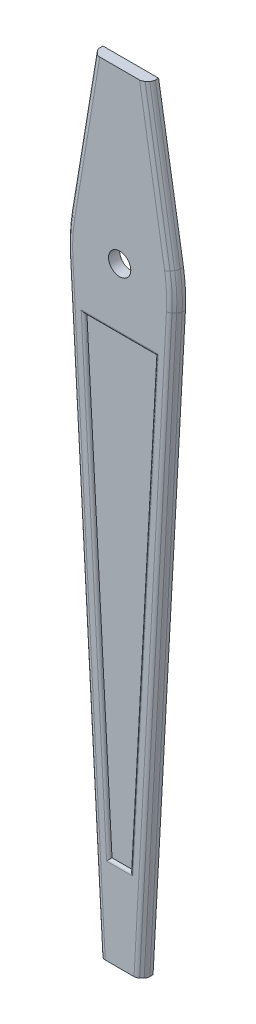
ISO-10303-21;
HEADER;
FILE_DESCRIPTION(('STEP AP214'),'2;1');
FILE_NAME('part.step','',(''),(''),'','','');
FILE_SCHEMA(('AUTOMOTIVE_DESIGN { 1 0 10303 214 1 1 1 1 }'));
ENDSEC;
DATA;
#1=APPLICATION_CONTEXT('core data for automotive mechanical design processes');
#2=APPLICATION_PROTOCOL_DEFINITION('international standard','automotive_design',2000,#1);
#3=PRODUCT_CONTEXT('',#1,'mechanical');
#4=PRODUCT('Part','Part','',(#3));
#5=PRODUCT_RELATED_PRODUCT_CATEGORY('part','',(#4));
#6=PRODUCT_DEFINITION_FORMATION('','',#4);
#7=PRODUCT_DEFINITION_CONTEXT('part definition',#1,'design');
#8=PRODUCT_DEFINITION('design','',#6,#7);
#9=PRODUCT_DEFINITION_SHAPE('','',#8);
#10=(LENGTH_UNIT() NAMED_UNIT(*) SI_UNIT(.MILLI.,.METRE.));
#11=(NAMED_UNIT(*) PLANE_ANGLE_UNIT() SI_UNIT($,.RADIAN.));
#12=(NAMED_UNIT(*) SI_UNIT($,.STERADIAN.) SOLID_ANGLE_UNIT());
#13=UNCERTAINTY_MEASURE_WITH_UNIT(LENGTH_MEASURE(1.E-05),#10,'distance_accuracy_value','');
#14=(GEOMETRIC_REPRESENTATION_CONTEXT(3) GLOBAL_UNCERTAINTY_ASSIGNED_CONTEXT((#13)) GLOBAL_UNIT_ASSIGNED_CONTEXT((#10,
#11,#12)) REPRESENTATION_CONTEXT('',''));
#15=CARTESIAN_POINT('',(0.,0.,0.));
#16=DIRECTION('',(0.,0.,1.));
#17=DIRECTION('',(1.,0.,0.));
#18=AXIS2_PLACEMENT_3D('',#15,#16,#17);
#19=CARTESIAN_POINT('',(2.01343590893741,-0.163373914825652,0.2));
#20=DIRECTION('',(0.,0.,1.));
#21=DIRECTION('',(1.,0.,0.));
#22=AXIS2_PLACEMENT_3D('',#19,#20,#21);
#23=PLANE('',#22);
#24=DIRECTION('',(0.0546626758161554,0.998504878241773,0.));
#25=VECTOR('',#24,1.);
#26=CARTESIAN_POINT('',(0.237159771264508,-9.36104356531021,0.2));
#27=LINE('',#26,#25);
#28=CARTESIAN_POINT('',(0.691673327623881,-1.05859593581233,0.2));
#29=VERTEX_POINT('',#28);
#30=CARTESIAN_POINT('',(0.234572169099772,-9.4083104315194,0.2));
#31=VERTEX_POINT('',#30);
#32=EDGE_CURVE('E58',#29,#31,#27,.F.);
#33=ORIENTED_EDGE('',*,*,#32,.T.);
#34=DIRECTION('',(1.,0.,0.));
#35=VECTOR('',#34,1.);
#36=CARTESIAN_POINT('',(-0.187234527352417,-9.4083104315194,0.2));
#37=LINE('',#36,#35);
#38=CARTESIAN_POINT('',(-0.234572169099769,-9.4083104315194,0.2));
#39=VERTEX_POINT('',#38);
#40=EDGE_CURVE('E11',#31,#39,#37,.F.);
#41=ORIENTED_EDGE('',*,*,#40,.T.);
#42=DIRECTION('',(0.0546626758161556,-0.998504878241773,0.));
#43=VECTOR('',#42,1.);
#44=CARTESIAN_POINT('',(-0.688786477233872,-1.11132906960314,0.2));
#45=LINE('',#44,#43);
#46=CARTESIAN_POINT('',(-0.691673327623879,-1.05859593581233,0.2));
#47=VERTEX_POINT('',#46);
#48=EDGE_CURVE('E43',#39,#47,#45,.F.);
#49=ORIENTED_EDGE('',*,*,#48,.T.);
#50=DIRECTION('',(-1.,0.,0.));
#51=VECTOR('',#50,1.);
#52=CARTESIAN_POINT('',(0.638861233321784,-1.05859593581233,0.2));
#53=LINE('',#52,#51);
#54=EDGE_CURVE('E367',#47,#29,#53,.F.);
#55=ORIENTED_EDGE('',*,*,#54,.T.);
#56=EDGE_LOOP('',(#33,#41,#49,#55));
#57=FACE_BOUND('',#56,.T.);
#58=CARTESIAN_POINT('',(-2.01343590893741,-0.163373914825651,0.2));
#59=DIRECTION('',(0.,0.,1.));
#60=DIRECTION('',(1.,0.,0.));
#61=AXIS2_PLACEMENT_3D('',#58,#59,#60);
#62=CIRCLE('',#61,2.85857864376269);
#63=CARTESIAN_POINT('',(0.840868811697392,-0.31963147252465,0.2));
#64=VERTEX_POINT('',#63);
#65=CARTESIAN_POINT('',(0.807245360112116,0.300553925478555,0.2));
#66=VERTEX_POINT('',#65);
#67=EDGE_CURVE('E342',#64,#66,#62,.T.);
#68=ORIENTED_EDGE('',*,*,#67,.T.);
#69=DIRECTION('',(-0.162293187670898,0.986742581039057,0.));
#70=VECTOR('',#69,1.);
#71=CARTESIAN_POINT('',(0.913309454097189,-0.344315765950688,0.2));
#72=LINE('',#71,#70);
#73=CARTESIAN_POINT('',(0.356678571539509,3.04,0.2));
#74=VERTEX_POINT('',#73);
#75=EDGE_CURVE('E344',#66,#74,#72,.T.);
#76=ORIENTED_EDGE('',*,*,#75,.T.);
#77=DIRECTION('',(-1.,0.,0.));
#78=VECTOR('',#77,1.);
#79=CARTESIAN_POINT('',(-0.5,3.04,0.2));
#80=LINE('',#79,#78);
#81=CARTESIAN_POINT('',(-0.35667857153951,3.04,0.2));
#82=VERTEX_POINT('',#81);
#83=EDGE_CURVE('E232',#74,#82,#80,.T.);
#84=ORIENTED_EDGE('',*,*,#83,.T.);
#85=DIRECTION('',(-0.162293187670897,-0.986742581039056,0.));
#86=VECTOR('',#85,1.);
#87=CARTESIAN_POINT('',(-0.807245360112117,0.300553925478546,0.2));
#88=LINE('',#87,#86);
#89=CARTESIAN_POINT('',(-0.807245360112116,0.300553925478554,0.2));
#90=VERTEX_POINT('',#89);
#91=EDGE_CURVE('E333',#82,#90,#88,.T.);
#92=ORIENTED_EDGE('',*,*,#91,.T.);
#93=CARTESIAN_POINT('',(2.01343590893741,-0.163373914825652,0.2));
#94=DIRECTION('',(0.,0.,1.));
#95=DIRECTION('',(1.,0.,0.));
#96=AXIS2_PLACEMENT_3D('',#93,#94,#95);
#97=CIRCLE('',#96,2.85857864376269);
#98=CARTESIAN_POINT('',(-0.840868811697391,-0.31963147252465,0.2));
#99=VERTEX_POINT('',#98);
#100=EDGE_CURVE('E335',#90,#99,#97,.T.);
#101=ORIENTED_EDGE('',*,*,#100,.T.);
#102=DIRECTION('',(0.0546626758161556,-0.998504878241773,0.));
#103=VECTOR('',#102,1.);
#104=CARTESIAN_POINT('',(-0.840868811697392,-0.319631472524637,0.2));
#105=LINE('',#104,#103);
#106=CARTESIAN_POINT('',(-0.258366885010783,-10.96,0.2));
#107=VERTEX_POINT('',#106);
#108=EDGE_CURVE('E337',#99,#107,#105,.T.);
#109=ORIENTED_EDGE('',*,*,#108,.T.);
#110=DIRECTION('',(1.,0.,0.));
#111=VECTOR('',#110,1.);
#112=CARTESIAN_POINT('',(-0.399999999999998,-10.96,0.2));
#113=LINE('',#112,#111);
#114=CARTESIAN_POINT('',(0.258366885010786,-10.96,0.2));
#115=VERTEX_POINT('',#114);
#116=EDGE_CURVE('E235',#107,#115,#113,.T.);
#117=ORIENTED_EDGE('',*,*,#116,.T.);
#118=DIRECTION('',(0.0546626758161554,0.998504878241773,0.));
#119=VECTOR('',#118,1.);
#120=CARTESIAN_POINT('',(0.852901137417129,-0.0998409893774615,0.2));
#121=LINE('',#120,#119);
#122=EDGE_CURVE('E340',#115,#64,#121,.T.);
#123=ORIENTED_EDGE('',*,*,#122,.T.);
#124=EDGE_LOOP('',(#68,#76,#84,#92,#101,#109,#117,#123));
#125=FACE_BOUND('',#124,.T.);
#126=CARTESIAN_POINT('',(0.,0.,0.2));
#127=DIRECTION('',(0.,0.,1.));
#128=DIRECTION('',(1.,0.,0.));
#129=AXIS2_PLACEMENT_3D('',#126,#127,#128);
#130=CIRCLE('',#129,0.2);
#131=CARTESIAN_POINT('',(0.2,0.,0.2));
#132=VERTEX_POINT('',#131);
#133=EDGE_CURVE('E224',#132,#132,#130,.T.);
#134=ORIENTED_EDGE('',*,*,#133,.F.);
#135=EDGE_LOOP('',(#134));
#136=FACE_BOUND('',#135,.T.);
#137=ADVANCED_FACE('F34',(#57,#125,#136),#23,.T.);
#138=CARTESIAN_POINT('',(2.01343590893741,-0.163373914825652,0.));
#139=DIRECTION('',(0.,0.,1.));
#140=DIRECTION('',(1.,0.,0.));
#141=AXIS2_PLACEMENT_3D('',#138,#139,#140);
#142=PLANE('',#141);
#143=DIRECTION('',(0.0546626758161554,0.998504878241773,0.));
#144=VECTOR('',#143,1.);
#145=CARTESIAN_POINT('',(0.982078725787913,-0.327361942274131,0.));
#146=LINE('',#145,#144);
#147=CARTESIAN_POINT('',(0.400000000000002,-10.96,0.));
#148=VERTEX_POINT('',#147);
#149=CARTESIAN_POINT('',(0.982078725787913,-0.327361942274131,0.));
#150=VERTEX_POINT('',#149);
#151=EDGE_CURVE('E227',#148,#150,#146,.T.);
#152=ORIENTED_EDGE('',*,*,#151,.F.);
#153=DIRECTION('',(1.,0.,0.));
#154=VECTOR('',#153,1.);
#155=CARTESIAN_POINT('',(-0.399999999999998,-10.96,0.));
#156=LINE('',#155,#154);
#157=CARTESIAN_POINT('',(-0.399999999999998,-10.96,0.));
#158=VERTEX_POINT('',#157);
#159=EDGE_CURVE('E236',#158,#148,#156,.T.);
#160=ORIENTED_EDGE('',*,*,#159,.F.);
#161=DIRECTION('',(0.0546626758161556,-0.998504878241773,0.));
#162=VECTOR('',#161,1.);
#163=CARTESIAN_POINT('',(-0.982078725787913,-0.327361942274132,0.));
#164=LINE('',#163,#162);
#165=CARTESIAN_POINT('',(-0.982078725787913,-0.327361942274132,0.));
#166=VERTEX_POINT('',#165);
#167=EDGE_CURVE('E257',#166,#158,#164,.T.);
#168=ORIENTED_EDGE('',*,*,#167,.F.);
#169=CARTESIAN_POINT('',(2.01343590893741,-0.163373914825652,0.));
#170=DIRECTION('',(0.,0.,1.));
#171=DIRECTION('',(1.,0.,0.));
#172=AXIS2_PLACEMENT_3D('',#169,#170,#171);
#173=CIRCLE('',#172,3.);
#174=CARTESIAN_POINT('',(-0.946791834179762,0.323505648187049,0.));
#175=VERTEX_POINT('',#174);
#176=EDGE_CURVE('E254',#175,#166,#173,.T.);
#177=ORIENTED_EDGE('',*,*,#176,.F.);
#178=DIRECTION('',(-0.162293187670897,-0.986742581039057,0.));
#179=VECTOR('',#178,1.);
#180=CARTESIAN_POINT('',(-0.946791834179762,0.323505648187049,0.));
#181=LINE('',#180,#179);
#182=CARTESIAN_POINT('',(-0.5,3.04,0.));
#183=VERTEX_POINT('',#182);
#184=EDGE_CURVE('E251',#183,#175,#181,.T.);
#185=ORIENTED_EDGE('',*,*,#184,.F.);
#186=DIRECTION('',(-1.,0.,0.));
#187=VECTOR('',#186,1.);
#188=CARTESIAN_POINT('',(-0.5,3.04,0.));
#189=LINE('',#188,#187);
#190=CARTESIAN_POINT('',(0.5,3.04,0.));
#191=VERTEX_POINT('',#190);
#192=EDGE_CURVE('E248',#191,#183,#189,.T.);
#193=ORIENTED_EDGE('',*,*,#192,.F.);
#194=DIRECTION('',(-0.162293187670898,0.986742581039056,0.));
#195=VECTOR('',#194,1.);
#196=CARTESIAN_POINT('',(0.946791834179762,0.323505648187049,0.));
#197=LINE('',#196,#195);
#198=CARTESIAN_POINT('',(0.946791834179762,0.323505648187049,0.));
#199=VERTEX_POINT('',#198);
#200=EDGE_CURVE('E245',#199,#191,#197,.T.);
#201=ORIENTED_EDGE('',*,*,#200,.F.);
#202=CARTESIAN_POINT('',(-2.01343590893741,-0.163373914825651,0.));
#203=DIRECTION('',(0.,0.,1.));
#204=DIRECTION('',(1.,0.,0.));
#205=AXIS2_PLACEMENT_3D('',#202,#203,#204);
#206=CIRCLE('',#205,3.);
#207=EDGE_CURVE('E242',#150,#199,#206,.T.);
#208=ORIENTED_EDGE('',*,*,#207,.F.);
#209=EDGE_LOOP('',(#152,#160,#168,#177,#185,#193,#201,#208));
#210=FACE_BOUND('',#209,.T.);
#211=CARTESIAN_POINT('',(0.,0.,0.));
#212=DIRECTION('',(0.,0.,1.));
#213=DIRECTION('',(1.,0.,0.));
#214=AXIS2_PLACEMENT_3D('',#211,#212,#213);
#215=CIRCLE('',#214,0.2);
#216=CARTESIAN_POINT('',(0.2,0.,0.));
#217=VERTEX_POINT('',#216);
#218=EDGE_CURVE('E228',#217,#217,#215,.T.);
#219=ORIENTED_EDGE('',*,*,#218,.T.);
#220=EDGE_LOOP('',(#219));
#221=FACE_BOUND('',#220,.T.);
#222=ADVANCED_FACE('F398',(#210,#221),#142,.F.);
#223=CARTESIAN_POINT('',(0.982078725787913,-0.327361942274131,0.2));
#224=DIRECTION('',(-0.998504878241773,0.0546626758161554,0.));
#225=DIRECTION('',(-0.0546626758161554,-0.998504878241773,0.));
#226=AXIS2_PLACEMENT_3D('',#223,#224,#225);
#227=PLANE('',#226);
#228=DIRECTION('',(0.,0.,-1.));
#229=VECTOR('',#228,1.);
#230=CARTESIAN_POINT('',(0.982078725787913,-0.327361942274131,0.2));
#231=LINE('',#230,#229);
#232=CARTESIAN_POINT('',(0.982078725787913,-0.327361942274131,0.0585786437626898));
#233=VERTEX_POINT('',#232);
#234=EDGE_CURVE('E275',#233,#150,#231,.T.);
#235=ORIENTED_EDGE('',*,*,#234,.F.);
#236=DIRECTION('',(-0.0546626758161554,-0.998504878241773,0.));
#237=VECTOR('',#236,1.);
#238=CARTESIAN_POINT('',(0.400000000000002,-10.96,0.0585786437626898));
#239=LINE('',#238,#237);
#240=CARTESIAN_POINT('',(0.400000000000002,-10.96,0.0585786437626898));
#241=VERTEX_POINT('',#240);
#242=EDGE_CURVE('E359',#233,#241,#239,.T.);
#243=ORIENTED_EDGE('',*,*,#242,.T.);
#244=DIRECTION('',(0.,0.,-1.));
#245=VECTOR('',#244,1.);
#246=CARTESIAN_POINT('',(0.400000000000002,-10.96,0.2));
#247=LINE('',#246,#245);
#248=EDGE_CURVE('E239',#241,#148,#247,.T.);
#249=ORIENTED_EDGE('',*,*,#248,.T.);
#250=ORIENTED_EDGE('',*,*,#151,.T.);
#251=EDGE_LOOP('',(#235,#243,#249,#250));
#252=FACE_BOUND('',#251,.T.);
#253=ADVANCED_FACE('F414',(#252),#227,.F.);
#254=CARTESIAN_POINT('',(-2.01343590893741,-0.163373914825651,0.2));
#255=DIRECTION('',(0.,0.,-1.));
#256=DIRECTION('',(-1.,0.,0.));
#257=AXIS2_PLACEMENT_3D('',#254,#255,#256);
#258=CYLINDRICAL_SURFACE('',#257,3.);
#259=DIRECTION('',(0.,0.,-1.));
#260=VECTOR('',#259,1.);
#261=CARTESIAN_POINT('',(0.946791834179762,0.323505648187049,0.2));
#262=LINE('',#261,#260);
#263=CARTESIAN_POINT('',(0.946791834179762,0.323505648187049,0.05857864376269));
#264=VERTEX_POINT('',#263);
#265=EDGE_CURVE('E273',#264,#199,#262,.T.);
#266=ORIENTED_EDGE('',*,*,#265,.F.);
#267=CARTESIAN_POINT('',(-2.01343590893741,-0.163373914825651,0.05857864376269));
#268=DIRECTION('',(0.,0.,1.));
#269=DIRECTION('',(1.,0.,0.));
#270=AXIS2_PLACEMENT_3D('',#267,#268,#269);
#271=CIRCLE('',#270,3.);
#272=EDGE_CURVE('E314',#264,#233,#271,.F.);
#273=ORIENTED_EDGE('',*,*,#272,.T.);
#274=ORIENTED_EDGE('',*,*,#234,.T.);
#275=ORIENTED_EDGE('',*,*,#207,.T.);
#276=EDGE_LOOP('',(#266,#273,#274,#275));
#277=FACE_BOUND('',#276,.T.);
#278=ADVANCED_FACE('F420',(#277),#258,.T.);
#279=CARTESIAN_POINT('',(0.946791834179762,0.323505648187049,0.2));
#280=DIRECTION('',(-0.986742581039056,-0.162293187670898,0.));
#281=DIRECTION('',(0.162293187670898,-0.986742581039057,0.));
#282=AXIS2_PLACEMENT_3D('',#279,#280,#281);
#283=PLANE('',#282);
#284=DIRECTION('',(0.,0.,-1.));
#285=VECTOR('',#284,1.);
#286=CARTESIAN_POINT('',(0.5,3.04,0.2));
#287=LINE('',#286,#285);
#288=CARTESIAN_POINT('',(0.5,3.04,0.0585786437626901));
#289=VERTEX_POINT('',#288);
#290=EDGE_CURVE('E271',#289,#191,#287,.T.);
#291=ORIENTED_EDGE('',*,*,#290,.F.);
#292=DIRECTION('',(0.162293187670898,-0.986742581039057,0.));
#293=VECTOR('',#292,1.);
#294=CARTESIAN_POINT('',(0.946791834179762,0.323505648187049,0.0585786437626901));
#295=LINE('',#294,#293);
#296=EDGE_CURVE('E289',#289,#264,#295,.T.);
#297=ORIENTED_EDGE('',*,*,#296,.T.);
#298=ORIENTED_EDGE('',*,*,#265,.T.);
#299=ORIENTED_EDGE('',*,*,#200,.T.);
#300=EDGE_LOOP('',(#291,#297,#298,#299));
#301=FACE_BOUND('',#300,.T.);
#302=ADVANCED_FACE('F443',(#301),#283,.F.);
#303=CARTESIAN_POINT('',(-0.5,3.04,0.2));
#304=DIRECTION('',(0.,-1.,0.));
#305=DIRECTION('',(0.,0.,-1.));
#306=AXIS2_PLACEMENT_3D('',#303,#304,#305);
#307=PLANE('',#306);
#308=DIRECTION('',(0.711809416457028,0.,-0.702372660802729));
#309=VECTOR('',#308,1.);
#310=CARTESIAN_POINT('',(0.680125880860248,3.04,-0.0777378765919796));
#311=LINE('',#310,#309);
#312=CARTESIAN_POINT('',(0.428339285769756,3.04,0.170710678118654));
#313=VERTEX_POINT('',#312);
#314=CARTESIAN_POINT('',(0.470317160276491,3.04,0.129289321881344));
#315=VERTEX_POINT('',#314);
#316=EDGE_CURVE('E286',#313,#315,#311,.T.);
#317=ORIENTED_EDGE('',*,*,#316,.T.);
#318=CARTESIAN_POINT('',(0.398656446046244,3.04,0.0585786437626901));
#319=DIRECTION('',(0.,-1.,0.));
#320=DIRECTION('',(-1.,0.,0.));
#321=AXIS2_PLACEMENT_3D('',#318,#319,#320);
#322=ELLIPSE('',#321,0.101343553953756,0.1);
#323=EDGE_CURVE('E312',#315,#289,#322,.F.);
#324=ORIENTED_EDGE('',*,*,#323,.T.);
#325=ORIENTED_EDGE('',*,*,#290,.T.);
#326=ORIENTED_EDGE('',*,*,#192,.T.);
#327=DIRECTION('',(0.,0.,-1.));
#328=VECTOR('',#327,1.);
#329=CARTESIAN_POINT('',(-0.5,3.04,0.2));
#330=LINE('',#329,#328);
#331=CARTESIAN_POINT('',(-0.5,3.04,0.0585786437626913));
#332=VERTEX_POINT('',#331);
#333=EDGE_CURVE('E269',#332,#183,#330,.T.);
#334=ORIENTED_EDGE('',*,*,#333,.F.);
#335=CARTESIAN_POINT('',(-0.398656446046244,3.04,0.0585786437626913));
#336=DIRECTION('',(0.,-1.,0.));
#337=DIRECTION('',(-1.,0.,0.));
#338=AXIS2_PLACEMENT_3D('',#335,#336,#337);
#339=ELLIPSE('',#338,0.101343553953756,0.1);
#340=CARTESIAN_POINT('',(-0.47031716027649,3.04,0.129289321881346));
#341=VERTEX_POINT('',#340);
#342=EDGE_CURVE('E310',#332,#341,#339,.F.);
#343=ORIENTED_EDGE('',*,*,#342,.T.);
#344=DIRECTION('',(0.711809416457034,0.,0.702372660802723));
#345=VECTOR('',#344,1.);
#346=CARTESIAN_POINT('',(-0.626386105783453,3.04,-0.0247105522282394));
#347=LINE('',#346,#345);
#348=CARTESIAN_POINT('',(-0.428339285769756,3.04,0.170710678118654));
#349=VERTEX_POINT('',#348);
#350=EDGE_CURVE('E283',#341,#349,#347,.T.);
#351=ORIENTED_EDGE('',*,*,#350,.T.);
#352=CARTESIAN_POINT('',(-0.35667857153951,3.04,0.1));
#353=DIRECTION('',(0.,-1.,0.));
#354=DIRECTION('',(-1.,0.,0.));
#355=AXIS2_PLACEMENT_3D('',#352,#353,#354);
#356=ELLIPSE('',#355,0.101343553953756,0.1);
#357=EDGE_CURVE('E306',#349,#82,#356,.F.);
#358=ORIENTED_EDGE('',*,*,#357,.T.);
#359=ORIENTED_EDGE('',*,*,#83,.F.);
#360=CARTESIAN_POINT('',(0.356678571539509,3.04,0.1));
#361=DIRECTION('',(0.,-1.,0.));
#362=DIRECTION('',(-1.,0.,0.));
#363=AXIS2_PLACEMENT_3D('',#360,#361,#362);
#364=ELLIPSE('',#363,0.101343553953756,0.1);
#365=EDGE_CURVE('E308',#74,#313,#364,.F.);
#366=ORIENTED_EDGE('',*,*,#365,.T.);
#367=EDGE_LOOP('',(#317,#324,#325,#326,#334,#343,#351,#358,#359,#366));
#368=FACE_BOUND('',#367,.T.);
#369=ADVANCED_FACE('F439',(#368),#307,.F.);
#370=CARTESIAN_POINT('',(-0.946791834179762,0.323505648187049,0.2));
#371=DIRECTION('',(0.986742581039056,-0.162293187670897,0.));
#372=DIRECTION('',(0.162293187670897,0.986742581039057,0.));
#373=AXIS2_PLACEMENT_3D('',#370,#371,#372);
#374=PLANE('',#373);
#375=DIRECTION('',(0.,0.,-1.));
#376=VECTOR('',#375,1.);
#377=CARTESIAN_POINT('',(-0.946791834179762,0.323505648187049,0.2));
#378=LINE('',#377,#376);
#379=CARTESIAN_POINT('',(-0.946791834179762,0.323505648187049,0.0585786437626896));
#380=VERTEX_POINT('',#379);
#381=EDGE_CURVE('E267',#380,#175,#378,.T.);
#382=ORIENTED_EDGE('',*,*,#381,.F.);
#383=DIRECTION('',(0.162293187670897,0.986742581039057,0.));
#384=VECTOR('',#383,1.);
#385=CARTESIAN_POINT('',(-0.5,3.04,0.0585786437626913));
#386=LINE('',#385,#384);
#387=EDGE_CURVE('E320',#380,#332,#386,.T.);
#388=ORIENTED_EDGE('',*,*,#387,.T.);
#389=ORIENTED_EDGE('',*,*,#333,.T.);
#390=ORIENTED_EDGE('',*,*,#184,.T.);
#391=EDGE_LOOP('',(#382,#388,#389,#390));
#392=FACE_BOUND('',#391,.T.);
#393=ADVANCED_FACE('F435',(#392),#374,.F.);
#394=CARTESIAN_POINT('',(2.01343590893741,-0.163373914825652,0.2));
#395=DIRECTION('',(0.,0.,-1.));
#396=DIRECTION('',(-1.,0.,0.));
#397=AXIS2_PLACEMENT_3D('',#394,#395,#396);
#398=CYLINDRICAL_SURFACE('',#397,3.);
#399=DIRECTION('',(0.,0.,-1.));
#400=VECTOR('',#399,1.);
#401=CARTESIAN_POINT('',(-0.982078725787913,-0.327361942274132,0.2));
#402=LINE('',#401,#400);
#403=CARTESIAN_POINT('',(-0.982078725787913,-0.327361942274132,0.0585786437626897));
#404=VERTEX_POINT('',#403);
#405=EDGE_CURVE('E265',#404,#166,#402,.T.);
#406=ORIENTED_EDGE('',*,*,#405,.F.);
#407=CARTESIAN_POINT('',(2.01343590893741,-0.163373914825652,0.0585786437626896));
#408=DIRECTION('',(0.,0.,1.));
#409=DIRECTION('',(1.,0.,0.));
#410=AXIS2_PLACEMENT_3D('',#407,#408,#409);
#411=CIRCLE('',#410,3.);
#412=EDGE_CURVE('E327',#404,#380,#411,.F.);
#413=ORIENTED_EDGE('',*,*,#412,.T.);
#414=ORIENTED_EDGE('',*,*,#381,.T.);
#415=ORIENTED_EDGE('',*,*,#176,.T.);
#416=EDGE_LOOP('',(#406,#413,#414,#415));
#417=FACE_BOUND('',#416,.T.);
#418=ADVANCED_FACE('F431',(#417),#398,.T.);
#419=CARTESIAN_POINT('',(-0.982078725787913,-0.327361942274132,0.2));
#420=DIRECTION('',(0.998504878241773,0.0546626758161556,0.));
#421=DIRECTION('',(-0.0546626758161556,0.998504878241773,0.));
#422=AXIS2_PLACEMENT_3D('',#419,#420,#421);
#423=PLANE('',#422);
#424=DIRECTION('',(0.,0.,-1.));
#425=VECTOR('',#424,1.);
#426=CARTESIAN_POINT('',(-0.399999999999998,-10.96,0.2));
#427=LINE('',#426,#425);
#428=CARTESIAN_POINT('',(-0.399999999999998,-10.96,0.0585786437626896));
#429=VERTEX_POINT('',#428);
#430=EDGE_CURVE('E263',#429,#158,#427,.T.);
#431=ORIENTED_EDGE('',*,*,#430,.F.);
#432=DIRECTION('',(-0.0546626758161556,0.998504878241773,0.));
#433=VECTOR('',#432,1.);
#434=CARTESIAN_POINT('',(-0.982078725787913,-0.327361942274132,0.0585786437626897));
#435=LINE('',#434,#433);
#436=EDGE_CURVE('E365',#429,#404,#435,.T.);
#437=ORIENTED_EDGE('',*,*,#436,.T.);
#438=ORIENTED_EDGE('',*,*,#405,.T.);
#439=ORIENTED_EDGE('',*,*,#167,.T.);
#440=EDGE_LOOP('',(#431,#437,#438,#439));
#441=FACE_BOUND('',#440,.T.);
#442=ADVANCED_FACE('F427',(#441),#423,.F.);
#443=CARTESIAN_POINT('',(-0.399999999999998,-10.96,0.2));
#444=DIRECTION('',(0.,1.,0.));
#445=DIRECTION('',(0.,0.,1.));
#446=AXIS2_PLACEMENT_3D('',#443,#444,#445);
#447=PLANE('',#446);
#448=ORIENTED_EDGE('',*,*,#116,.F.);
#449=CARTESIAN_POINT('',(-0.258366885010783,-10.96,0.1));
#450=DIRECTION('',(0.,1.,0.));
#451=DIRECTION('',(1.,0.,0.));
#452=AXIS2_PLACEMENT_3D('',#449,#450,#451);
#453=ELLIPSE('',#452,0.100149736049448,0.1);
#454=CARTESIAN_POINT('',(-0.329183442505391,-10.96,0.170710678118654));
#455=VERTEX_POINT('',#454);
#456=EDGE_CURVE('E353',#107,#455,#453,.F.);
#457=ORIENTED_EDGE('',*,*,#456,.T.);
#458=DIRECTION('',(-0.707635583987797,0.,-0.706577582629289));
#459=VECTOR('',#458,1.);
#460=CARTESIAN_POINT('',(-0.591474939407345,-10.96,-0.0911886610592867));
#461=LINE('',#460,#459);
#462=CARTESIAN_POINT('',(-0.370666821445158,-10.96,0.129289321881344));
#463=VERTEX_POINT('',#462);
#464=EDGE_CURVE('E277',#455,#463,#461,.T.);
#465=ORIENTED_EDGE('',*,*,#464,.T.);
#466=CARTESIAN_POINT('',(-0.29985026395055,-10.96,0.0585786437626896));
#467=DIRECTION('',(0.,1.,0.));
#468=DIRECTION('',(1.,0.,0.));
#469=AXIS2_PLACEMENT_3D('',#466,#467,#468);
#470=ELLIPSE('',#469,0.100149736049448,0.1);
#471=EDGE_CURVE('E349',#463,#429,#470,.F.);
#472=ORIENTED_EDGE('',*,*,#471,.T.);
#473=ORIENTED_EDGE('',*,*,#430,.T.);
#474=ORIENTED_EDGE('',*,*,#159,.T.);
#475=ORIENTED_EDGE('',*,*,#248,.F.);
#476=CARTESIAN_POINT('',(0.299850263950554,-10.96,0.0585786437626898));
#477=DIRECTION('',(0.,1.,0.));
#478=DIRECTION('',(1.,0.,0.));
#479=AXIS2_PLACEMENT_3D('',#476,#477,#478);
#480=ELLIPSE('',#479,0.100149736049448,0.1);
#481=CARTESIAN_POINT('',(0.370666821445162,-10.96,0.129289321881344));
#482=VERTEX_POINT('',#481);
#483=EDGE_CURVE('E351',#241,#482,#480,.F.);
#484=ORIENTED_EDGE('',*,*,#483,.T.);
#485=DIRECTION('',(-0.707635583987796,0.,0.70657758262929));
#486=VECTOR('',#485,1.);
#487=CARTESIAN_POINT('',(0.597500103887432,-10.96,-0.0972048171848599));
#488=LINE('',#487,#486);
#489=CARTESIAN_POINT('',(0.329183442505394,-10.96,0.170710678118654));
#490=VERTEX_POINT('',#489);
#491=EDGE_CURVE('E280',#482,#490,#488,.T.);
#492=ORIENTED_EDGE('',*,*,#491,.T.);
#493=CARTESIAN_POINT('',(0.258366885010786,-10.96,0.1));
#494=DIRECTION('',(0.,1.,0.));
#495=DIRECTION('',(1.,0.,0.));
#496=AXIS2_PLACEMENT_3D('',#493,#494,#495);
#497=ELLIPSE('',#496,0.100149736049448,0.1);
#498=EDGE_CURVE('E347',#490,#115,#497,.F.);
#499=ORIENTED_EDGE('',*,*,#498,.T.);
#500=EDGE_LOOP('',(#448,#457,#465,#472,#473,#474,#475,#484,#492,#499));
#501=FACE_BOUND('',#500,.T.);
#502=ADVANCED_FACE('F409',(#501),#447,.F.);
#503=CARTESIAN_POINT('',(0.,0.,0.2));
#504=DIRECTION('',(0.,0.,-1.));
#505=DIRECTION('',(-1.,0.,0.));
#506=AXIS2_PLACEMENT_3D('',#503,#504,#505);
#507=CYLINDRICAL_SURFACE('',#506,0.2);
#508=ORIENTED_EDGE('',*,*,#133,.T.);
#509=EDGE_LOOP('',(#508));
#510=FACE_BOUND('',#509,.T.);
#511=ORIENTED_EDGE('',*,*,#218,.F.);
#512=EDGE_LOOP('',(#511));
#513=FACE_BOUND('',#512,.T.);
#514=ADVANCED_FACE('F405',(#510,#513),#507,.F.);
#515=CARTESIAN_POINT('',(0.954181670060931,-0.337593362009283,0.2));
#516=DIRECTION('',(0.697732370338241,0.114758613542474,0.70710678118654));
#517=DIRECTION('',(0.162293187670898,-0.986742581039057,0.));
#518=AXIS2_PLACEMENT_3D('',#515,#516,#517);
#519=PLANE('',#518);
#520=DIRECTION('',(-0.697732370338225,-0.114758613542473,0.707106781186555));
#521=VECTOR('',#520,1.);
#522=CARTESIAN_POINT('',(0.946791834179762,0.323505648187049,0.0999999999999989));
#523=LINE('',#522,#521);
#524=CARTESIAN_POINT('',(0.917890813109681,0.318752190774207,0.129289321881344));
#525=VERTEX_POINT('',#524);
#526=CARTESIAN_POINT('',(0.87701859714594,0.312029786832802,0.170710678118654));
#527=VERTEX_POINT('',#526);
#528=EDGE_CURVE('E231',#525,#527,#523,.T.);
#529=ORIENTED_EDGE('',*,*,#528,.F.);
#530=DIRECTION('',(0.162293187670898,-0.986742581039056,0.));
#531=VECTOR('',#530,1.);
#532=CARTESIAN_POINT('',(0.471098978929919,3.03524654258716,0.129289321881344));
#533=LINE('',#532,#531);
#534=EDGE_CURVE('E304',#525,#315,#533,.F.);
#535=ORIENTED_EDGE('',*,*,#534,.T.);
#536=ORIENTED_EDGE('',*,*,#316,.F.);
#537=DIRECTION('',(-0.162293187670898,0.986742581039056,0.));
#538=VECTOR('',#537,1.);
#539=CARTESIAN_POINT('',(0.983082691131013,-0.33283990459644,0.170710678118654));
#540=LINE('',#539,#538);
#541=EDGE_CURVE('E302',#313,#527,#540,.F.);
#542=ORIENTED_EDGE('',*,*,#541,.T.);
#543=EDGE_LOOP('',(#529,#535,#536,#542));
#544=FACE_BOUND('',#543,.T.);
#545=ADVANCED_FACE('F408',(#544),#519,.T.);
#546=CARTESIAN_POINT('',(-2.01343590893741,-0.163373914825651,0.2));
#547=DIRECTION('',(0.,0.,-1.));
#548=DIRECTION('',(-1.,0.,0.));
#549=AXIS2_PLACEMENT_3D('',#546,#547,#548);
#550=CONICAL_SURFACE('',#549,2.9,0.785398163397438);
#551=DIRECTION('',(-0.706049570452599,0.0386523487474053,0.707106781186554));
#552=VECTOR('',#551,1.);
#553=CARTESIAN_POINT('',(0.982078725787913,-0.327361942274131,0.0999999999999989));
#554=LINE('',#553,#552);
#555=CARTESIAN_POINT('',(0.952833195008997,-0.325760909567256,0.129289321881344));
#556=VERTEX_POINT('',#555);
#557=CARTESIAN_POINT('',(0.911473768742653,-0.323496707399391,0.170710678118654));
#558=VERTEX_POINT('',#557);
#559=EDGE_CURVE('E290',#556,#558,#554,.T.);
#560=ORIENTED_EDGE('',*,*,#559,.F.);
#561=CARTESIAN_POINT('',(-2.01343590893741,-0.163373914825651,0.129289321881344));
#562=DIRECTION('',(0.,0.,-1.));
#563=DIRECTION('',(-1.,0.,0.));
#564=AXIS2_PLACEMENT_3D('',#561,#562,#563);
#565=CIRCLE('',#564,2.97071067811866);
#566=EDGE_CURVE('E318',#556,#525,#565,.F.);
#567=ORIENTED_EDGE('',*,*,#566,.T.);
#568=ORIENTED_EDGE('',*,*,#528,.T.);
#569=CARTESIAN_POINT('',(-2.01343590893741,-0.163373914825651,0.170710678118654));
#570=DIRECTION('',(0.,0.,1.));
#571=DIRECTION('',(1.,0.,0.));
#572=AXIS2_PLACEMENT_3D('',#569,#570,#571);
#573=CIRCLE('',#572,2.92928932188135);
#574=EDGE_CURVE('E316',#527,#558,#573,.F.);
#575=ORIENTED_EDGE('',*,*,#574,.T.);
#576=EDGE_LOOP('',(#560,#567,#568,#575));
#577=FACE_BOUND('',#576,.T.);
#578=ADVANCED_FACE('F455',(#577),#550,.T.);
#579=CARTESIAN_POINT('',(0.894260563683473,-0.102105191545327,0.2));
#580=DIRECTION('',(0.70604957045261,-0.0386523487474056,0.707106781186543));
#581=DIRECTION('',(-0.0546626758161554,-0.998504878241773,0.));
#582=AXIS2_PLACEMENT_3D('',#579,#580,#581);
#583=PLANE('',#582);
#584=ORIENTED_EDGE('',*,*,#491,.F.);
#585=DIRECTION('',(-0.0546626758161554,-0.998504878241773,0.));
#586=VECTOR('',#585,1.);
#587=CARTESIAN_POINT('',(0.952833195008997,-0.325760909567256,0.129289321881344));
#588=LINE('',#587,#586);
#589=EDGE_CURVE('E363',#482,#556,#588,.F.);
#590=ORIENTED_EDGE('',*,*,#589,.T.);
#591=ORIENTED_EDGE('',*,*,#559,.T.);
#592=DIRECTION('',(0.0546626758161554,0.998504878241773,0.));
#593=VECTOR('',#592,1.);
#594=CARTESIAN_POINT('',(0.92350609446239,-0.103706224252202,0.170710678118654));
#595=LINE('',#594,#593);
#596=EDGE_CURVE('E361',#558,#490,#595,.F.);
#597=ORIENTED_EDGE('',*,*,#596,.T.);
#598=EDGE_LOOP('',(#584,#590,#591,#597));
#599=FACE_BOUND('',#598,.T.);
#600=ADVANCED_FACE('F451',(#599),#583,.T.);
#601=CARTESIAN_POINT('',(-0.882228237963736,-0.321895674692503,0.2));
#602=DIRECTION('',(-0.70604957045261,-0.0386523487474058,0.707106781186543));
#603=DIRECTION('',(-0.0546626758161556,0.998504878241773,0.));
#604=AXIS2_PLACEMENT_3D('',#601,#602,#603);
#605=PLANE('',#604);
#606=ORIENTED_EDGE('',*,*,#464,.F.);
#607=DIRECTION('',(0.0546626758161556,-0.998504878241773,0.));
#608=VECTOR('',#607,1.);
#609=CARTESIAN_POINT('',(-0.911473768742653,-0.323496707399378,0.170710678118654));
#610=LINE('',#609,#608);
#611=CARTESIAN_POINT('',(-0.911473768742652,-0.323496707399391,0.170710678118654));
#612=VERTEX_POINT('',#611);
#613=EDGE_CURVE('E357',#455,#612,#610,.F.);
#614=ORIENTED_EDGE('',*,*,#613,.T.);
#615=DIRECTION('',(0.706049570452602,0.0386523487474082,0.707106781186551));
#616=VECTOR('',#615,1.);
#617=CARTESIAN_POINT('',(-0.982078725787913,-0.327361942274132,0.0999999999999989));
#618=LINE('',#617,#616);
#619=CARTESIAN_POINT('',(-0.952833195008996,-0.325760909567257,0.129289321881344));
#620=VERTEX_POINT('',#619);
#621=EDGE_CURVE('E293',#620,#612,#618,.T.);
#622=ORIENTED_EDGE('',*,*,#621,.F.);
#623=DIRECTION('',(-0.0546626758161556,0.998504878241773,0.));
#624=VECTOR('',#623,1.);
#625=CARTESIAN_POINT('',(-0.370754469221082,-10.9583989672931,0.129289321881344));
#626=LINE('',#625,#624);
#627=EDGE_CURVE('E355',#620,#463,#626,.F.);
#628=ORIENTED_EDGE('',*,*,#627,.T.);
#629=EDGE_LOOP('',(#606,#614,#622,#628));
#630=FACE_BOUND('',#629,.T.);
#631=ADVANCED_FACE('F454',(#630),#605,.T.);
#632=CARTESIAN_POINT('',(2.01343590893741,-0.163373914825652,0.2));
#633=DIRECTION('',(0.,0.,-1.));
#634=DIRECTION('',(-1.,0.,0.));
#635=AXIS2_PLACEMENT_3D('',#632,#633,#634);
#636=CONICAL_SURFACE('',#635,2.9,0.785398163397442);
#637=DIRECTION('',(0.69773237033823,-0.114758613542472,0.707106781186551));
#638=VECTOR('',#637,1.);
#639=CARTESIAN_POINT('',(-0.946791834179762,0.323505648187049,0.0999999999999989));
#640=LINE('',#639,#638);
#641=CARTESIAN_POINT('',(-0.917890813109681,0.318752190774206,0.129289321881344));
#642=VERTEX_POINT('',#641);
#643=CARTESIAN_POINT('',(-0.877018597145939,0.312029786832802,0.170710678118654));
#644=VERTEX_POINT('',#643);
#645=EDGE_CURVE('E223',#642,#644,#640,.T.);
#646=ORIENTED_EDGE('',*,*,#645,.F.);
#647=CARTESIAN_POINT('',(2.01343590893741,-0.163373914825652,0.129289321881344));
#648=DIRECTION('',(0.,0.,-1.));
#649=DIRECTION('',(-1.,0.,0.));
#650=AXIS2_PLACEMENT_3D('',#647,#648,#649);
#651=CIRCLE('',#650,2.97071067811866);
#652=EDGE_CURVE('E331',#642,#620,#651,.F.);
#653=ORIENTED_EDGE('',*,*,#652,.T.);
#654=ORIENTED_EDGE('',*,*,#621,.T.);
#655=CARTESIAN_POINT('',(2.01343590893741,-0.163373914825652,0.170710678118654));
#656=DIRECTION('',(0.,0.,1.));
#657=DIRECTION('',(1.,0.,0.));
#658=AXIS2_PLACEMENT_3D('',#655,#656,#657);
#659=CIRCLE('',#658,2.92928932188135);
#660=EDGE_CURVE('E329',#612,#644,#659,.F.);
#661=ORIENTED_EDGE('',*,*,#660,.T.);
#662=EDGE_LOOP('',(#646,#653,#654,#661));
#663=FACE_BOUND('',#662,.T.);
#664=ADVANCED_FACE('F466',(#663),#636,.T.);
#665=CARTESIAN_POINT('',(-0.848117576075859,0.307276329419951,0.2));
#666=DIRECTION('',(-0.697732370338235,0.114758613542473,0.707106781186545));
#667=DIRECTION('',(0.162293187670897,0.986742581039057,0.));
#668=AXIS2_PLACEMENT_3D('',#665,#666,#667);
#669=PLANE('',#668);
#670=ORIENTED_EDGE('',*,*,#350,.F.);
#671=DIRECTION('',(0.162293187670897,0.986742581039056,0.));
#672=VECTOR('',#671,1.);
#673=CARTESIAN_POINT('',(-0.91789081310968,0.318752190774206,0.129289321881346));
#674=LINE('',#673,#672);
#675=EDGE_CURVE('E325',#341,#642,#674,.F.);
#676=ORIENTED_EDGE('',*,*,#675,.T.);
#677=ORIENTED_EDGE('',*,*,#645,.T.);
#678=DIRECTION('',(-0.162293187670897,-0.986742581039056,0.));
#679=VECTOR('',#678,1.);
#680=CARTESIAN_POINT('',(-0.877018597145941,0.312029786832793,0.170710678118654));
#681=LINE('',#680,#679);
#682=EDGE_CURVE('E323',#644,#349,#681,.F.);
#683=ORIENTED_EDGE('',*,*,#682,.T.);
#684=EDGE_LOOP('',(#670,#676,#677,#683));
#685=FACE_BOUND('',#684,.T.);
#686=ADVANCED_FACE('F463',(#685),#669,.T.);
#687=CARTESIAN_POINT('',(0.,0.,0.15));
#688=DIRECTION('',(0.,0.,1.));
#689=DIRECTION('',(1.,0.,0.));
#690=AXIS2_PLACEMENT_3D('',#687,#688,#689);
#691=PLANE('',#690);
#692=DIRECTION('',(1.,0.,0.));
#693=VECTOR('',#692,1.);
#694=CARTESIAN_POINT('',(-0.187234527352417,-9.3583104315194,0.15));
#695=LINE('',#694,#693);
#696=CARTESIAN_POINT('',(-0.187234527352417,-9.3583104315194,0.15));
#697=VERTEX_POINT('',#696);
#698=CARTESIAN_POINT('',(0.18723452735242,-9.3583104315194,0.15));
#699=VERTEX_POINT('',#698);
#700=EDGE_CURVE('E200',#697,#699,#695,.T.);
#701=ORIENTED_EDGE('',*,*,#700,.T.);
#702=DIRECTION('',(0.0546626758161554,0.998504878241773,0.));
#703=VECTOR('',#702,1.);
#704=CARTESIAN_POINT('',(0.18723452735242,-9.3583104315194,0.15));
#705=LINE('',#704,#703);
#706=CARTESIAN_POINT('',(0.638861233321784,-1.10859593581233,0.15));
#707=VERTEX_POINT('',#706);
#708=EDGE_CURVE('E204',#699,#707,#705,.T.);
#709=ORIENTED_EDGE('',*,*,#708,.T.);
#710=DIRECTION('',(-1.,0.,0.));
#711=VECTOR('',#710,1.);
#712=CARTESIAN_POINT('',(-0.638861233321783,-1.10859593581233,0.15));
#713=LINE('',#712,#711);
#714=CARTESIAN_POINT('',(-0.638861233321783,-1.10859593581233,0.15));
#715=VERTEX_POINT('',#714);
#716=EDGE_CURVE('E210',#707,#715,#713,.T.);
#717=ORIENTED_EDGE('',*,*,#716,.T.);
#718=DIRECTION('',(0.0546626758161556,-0.998504878241773,0.));
#719=VECTOR('',#718,1.);
#720=CARTESIAN_POINT('',(-0.638861233321783,-1.10859593581233,0.15));
#721=LINE('',#720,#719);
#722=EDGE_CURVE('E214',#715,#697,#721,.T.);
#723=ORIENTED_EDGE('',*,*,#722,.T.);
#724=EDGE_LOOP('',(#701,#709,#717,#723));
#725=FACE_BOUND('',#724,.T.);
#726=ADVANCED_FACE('F212',(#725),#691,.T.);
#727=CARTESIAN_POINT('',(0.882228237963736,-0.321895674692516,0.0585786437626898));
#728=DIRECTION('',(0.0546626758161554,0.998504878241773,0.));
#729=DIRECTION('',(-0.998504878241773,0.0546626758161554,0.));
#730=AXIS2_PLACEMENT_3D('',#727,#728,#729);
#731=CYLINDRICAL_SURFACE('',#730,0.1);
#732=ORIENTED_EDGE('',*,*,#483,.F.);
#733=ORIENTED_EDGE('',*,*,#242,.F.);
#734=CARTESIAN_POINT('',(0.882228237963736,-0.321895674692516,0.0585786437626898));
#735=DIRECTION('',(0.0546626758161548,0.998504878241773,0.));
#736=DIRECTION('',(-0.998504878241773,0.0546626758161548,0.));
#737=AXIS2_PLACEMENT_3D('',#734,#735,#736);
#738=CIRCLE('',#737,0.1);
#739=EDGE_CURVE('E215',#556,#233,#738,.T.);
#740=ORIENTED_EDGE('',*,*,#739,.F.);
#741=ORIENTED_EDGE('',*,*,#589,.F.);
#742=EDGE_LOOP('',(#732,#733,#740,#741));
#743=FACE_BOUND('',#742,.T.);
#744=ADVANCED_FACE('F482',(#743),#731,.T.);
#745=CARTESIAN_POINT('',(-2.01343590893741,-0.163373914825651,0.05857864376269));
#746=DIRECTION('',(0.,0.,1.));
#747=DIRECTION('',(1.,0.,0.));
#748=AXIS2_PLACEMENT_3D('',#745,#746,#747);
#749=TOROIDAL_SURFACE('',#748,2.9,0.1);
#750=ORIENTED_EDGE('',*,*,#739,.T.);
#751=ORIENTED_EDGE('',*,*,#272,.F.);
#752=CARTESIAN_POINT('',(0.848117576075857,0.307276329419959,0.05857864376269));
#753=DIRECTION('',(-0.1622931876709,0.986742581039056,0.));
#754=DIRECTION('',(-0.986742581039056,-0.1622931876709,0.));
#755=AXIS2_PLACEMENT_3D('',#752,#753,#754);
#756=CIRCLE('',#755,0.1);
#757=EDGE_CURVE('E218',#525,#264,#756,.T.);
#758=ORIENTED_EDGE('',*,*,#757,.F.);
#759=ORIENTED_EDGE('',*,*,#566,.F.);
#760=EDGE_LOOP('',(#750,#751,#758,#759));
#761=FACE_BOUND('',#760,.T.);
#762=ADVANCED_FACE('F478',(#761),#749,.T.);
#763=CARTESIAN_POINT('',(0.848117576075857,0.30727632941996,0.0585786437626901));
#764=DIRECTION('',(-0.162293187670898,0.986742581039056,0.));
#765=DIRECTION('',(-0.986742581039057,-0.162293187670898,0.));
#766=AXIS2_PLACEMENT_3D('',#763,#764,#765);
#767=CYLINDRICAL_SURFACE('',#766,0.1);
#768=ORIENTED_EDGE('',*,*,#323,.F.);
#769=ORIENTED_EDGE('',*,*,#534,.F.);
#770=ORIENTED_EDGE('',*,*,#757,.T.);
#771=ORIENTED_EDGE('',*,*,#296,.F.);
#772=EDGE_LOOP('',(#768,#769,#770,#771));
#773=FACE_BOUND('',#772,.T.);
#774=ADVANCED_FACE('F474',(#773),#767,.T.);
#775=CARTESIAN_POINT('',(-0.882228237963735,-0.321895674692516,0.0585786437626897));
#776=DIRECTION('',(0.0546626758161556,-0.998504878241773,0.));
#777=DIRECTION('',(0.998504878241773,0.0546626758161556,0.));
#778=AXIS2_PLACEMENT_3D('',#775,#776,#777);
#779=CYLINDRICAL_SURFACE('',#778,0.1);
#780=ORIENTED_EDGE('',*,*,#471,.F.);
#781=ORIENTED_EDGE('',*,*,#627,.F.);
#782=CARTESIAN_POINT('',(-0.882228237963735,-0.321895674692516,0.0585786437626897));
#783=DIRECTION('',(-0.0546626758161559,0.998504878241773,0.));
#784=DIRECTION('',(-0.998504878241773,-0.0546626758161559,0.));
#785=AXIS2_PLACEMENT_3D('',#782,#783,#784);
#786=CIRCLE('',#785,0.1);
#787=EDGE_CURVE('E368',#404,#620,#786,.T.);
#788=ORIENTED_EDGE('',*,*,#787,.F.);
#789=ORIENTED_EDGE('',*,*,#436,.F.);
#790=EDGE_LOOP('',(#780,#781,#788,#789));
#791=FACE_BOUND('',#790,.T.);
#792=ADVANCED_FACE('F477',(#791),#779,.T.);
#793=CARTESIAN_POINT('',(2.01343590893741,-0.163373914825652,0.0585786437626896));
#794=DIRECTION('',(0.,0.,1.));
#795=DIRECTION('',(1.,0.,0.));
#796=AXIS2_PLACEMENT_3D('',#793,#794,#795);
#797=TOROIDAL_SURFACE('',#796,2.9,0.1);
#798=ORIENTED_EDGE('',*,*,#787,.T.);
#799=ORIENTED_EDGE('',*,*,#652,.F.);
#800=CARTESIAN_POINT('',(-0.848117576075856,0.307276329419959,0.0585786437626896));
#801=DIRECTION('',(0.1622931876709,0.986742581039056,0.));
#802=DIRECTION('',(-0.986742581039056,0.1622931876709,0.));
#803=AXIS2_PLACEMENT_3D('',#800,#801,#802);
#804=CIRCLE('',#803,0.1);
#805=EDGE_CURVE('E370',#380,#642,#804,.T.);
#806=ORIENTED_EDGE('',*,*,#805,.F.);
#807=ORIENTED_EDGE('',*,*,#412,.F.);
#808=EDGE_LOOP('',(#798,#799,#806,#807));
#809=FACE_BOUND('',#808,.T.);
#810=ADVANCED_FACE('F491',(#809),#797,.T.);
#811=CARTESIAN_POINT('',(-0.848117576075856,0.307276329419959,0.0585786437626913));
#812=DIRECTION('',(-0.162293187670897,-0.986742581039056,0.));
#813=DIRECTION('',(0.986742581039056,-0.162293187670897,0.));
#814=AXIS2_PLACEMENT_3D('',#811,#812,#813);
#815=CYLINDRICAL_SURFACE('',#814,0.1);
#816=ORIENTED_EDGE('',*,*,#805,.T.);
#817=ORIENTED_EDGE('',*,*,#675,.F.);
#818=ORIENTED_EDGE('',*,*,#342,.F.);
#819=ORIENTED_EDGE('',*,*,#387,.F.);
#820=EDGE_LOOP('',(#816,#817,#818,#819));
#821=FACE_BOUND('',#820,.T.);
#822=ADVANCED_FACE('F487',(#821),#815,.T.);
#823=CARTESIAN_POINT('',(0.852901137417129,-0.0998409893774615,0.1));
#824=DIRECTION('',(0.0546626758161554,0.998504878241773,0.));
#825=DIRECTION('',(-0.998504878241773,0.0546626758161554,0.));
#826=AXIS2_PLACEMENT_3D('',#823,#824,#825);
#827=CYLINDRICAL_SURFACE('',#826,0.1);
#828=ORIENTED_EDGE('',*,*,#498,.F.);
#829=ORIENTED_EDGE('',*,*,#596,.F.);
#830=CARTESIAN_POINT('',(0.840868811697392,-0.31963147252465,0.1));
#831=DIRECTION('',(0.0546626758161599,0.998504878241773,0.));
#832=DIRECTION('',(-0.998504878241773,0.0546626758161599,0.));
#833=AXIS2_PLACEMENT_3D('',#830,#831,#832);
#834=CIRCLE('',#833,0.1);
#835=EDGE_CURVE('E373',#64,#558,#834,.T.);
#836=ORIENTED_EDGE('',*,*,#835,.F.);
#837=ORIENTED_EDGE('',*,*,#122,.F.);
#838=EDGE_LOOP('',(#828,#829,#836,#837));
#839=FACE_BOUND('',#838,.T.);
#840=ADVANCED_FACE('F490',(#839),#827,.T.);
#841=CARTESIAN_POINT('',(-2.01343590893741,-0.163373914825651,0.1));
#842=DIRECTION('',(0.,0.,1.));
#843=DIRECTION('',(1.,0.,0.));
#844=AXIS2_PLACEMENT_3D('',#841,#842,#843);
#845=TOROIDAL_SURFACE('',#844,2.85857864376269,0.1);
#846=ORIENTED_EDGE('',*,*,#835,.T.);
#847=ORIENTED_EDGE('',*,*,#574,.F.);
#848=CARTESIAN_POINT('',(0.807245360112116,0.300553925478555,0.1));
#849=DIRECTION('',(-0.162293187670898,0.986742581039056,0.));
#850=DIRECTION('',(-0.986742581039056,-0.162293187670898,0.));
#851=AXIS2_PLACEMENT_3D('',#848,#849,#850);
#852=CIRCLE('',#851,0.1);
#853=EDGE_CURVE('E376',#66,#527,#852,.T.);
#854=ORIENTED_EDGE('',*,*,#853,.F.);
#855=ORIENTED_EDGE('',*,*,#67,.F.);
#856=EDGE_LOOP('',(#846,#847,#854,#855));
#857=FACE_BOUND('',#856,.T.);
#858=ADVANCED_FACE('F503',(#857),#845,.T.);
#859=CARTESIAN_POINT('',(0.913309454097189,-0.344315765950688,0.1));
#860=DIRECTION('',(-0.162293187670898,0.986742581039056,0.));
#861=DIRECTION('',(-0.986742581039057,-0.162293187670898,0.));
#862=AXIS2_PLACEMENT_3D('',#859,#860,#861);
#863=CYLINDRICAL_SURFACE('',#862,0.1);
#864=ORIENTED_EDGE('',*,*,#853,.T.);
#865=ORIENTED_EDGE('',*,*,#541,.F.);
#866=ORIENTED_EDGE('',*,*,#365,.F.);
#867=ORIENTED_EDGE('',*,*,#75,.F.);
#868=EDGE_LOOP('',(#864,#865,#866,#867));
#869=FACE_BOUND('',#868,.T.);
#870=ADVANCED_FACE('F499',(#869),#863,.T.);
#871=CARTESIAN_POINT('',(-0.807245360112118,0.300553925478546,0.1));
#872=DIRECTION('',(-0.162293187670897,-0.986742581039056,0.));
#873=DIRECTION('',(0.986742581039056,-0.162293187670897,0.));
#874=AXIS2_PLACEMENT_3D('',#871,#872,#873);
#875=CYLINDRICAL_SURFACE('',#874,0.1);
#876=ORIENTED_EDGE('',*,*,#357,.F.);
#877=ORIENTED_EDGE('',*,*,#682,.F.);
#878=CARTESIAN_POINT('',(-0.807245360112116,0.300553925478554,0.1));
#879=DIRECTION('',(-0.1622931876709,-0.986742581039056,0.));
#880=DIRECTION('',(0.986742581039056,-0.1622931876709,0.));
#881=AXIS2_PLACEMENT_3D('',#878,#879,#880);
#882=CIRCLE('',#881,0.1);
#883=EDGE_CURVE('E379',#90,#644,#882,.T.);
#884=ORIENTED_EDGE('',*,*,#883,.F.);
#885=ORIENTED_EDGE('',*,*,#91,.F.);
#886=EDGE_LOOP('',(#876,#877,#884,#885));
#887=FACE_BOUND('',#886,.T.);
#888=ADVANCED_FACE('F502',(#887),#875,.T.);
#889=CARTESIAN_POINT('',(2.01343590893741,-0.163373914825652,0.1));
#890=DIRECTION('',(0.,0.,1.));
#891=DIRECTION('',(1.,0.,0.));
#892=AXIS2_PLACEMENT_3D('',#889,#890,#891);
#893=TOROIDAL_SURFACE('',#892,2.85857864376269,0.1);
#894=ORIENTED_EDGE('',*,*,#883,.T.);
#895=ORIENTED_EDGE('',*,*,#660,.F.);
#896=CARTESIAN_POINT('',(-0.840868811697391,-0.31963147252465,0.1));
#897=DIRECTION('',(0.054662675816155,-0.998504878241773,0.));
#898=DIRECTION('',(0.998504878241773,0.054662675816155,0.));
#899=AXIS2_PLACEMENT_3D('',#896,#897,#898);
#900=CIRCLE('',#899,0.1);
#901=EDGE_CURVE('E382',#99,#612,#900,.T.);
#902=ORIENTED_EDGE('',*,*,#901,.F.);
#903=ORIENTED_EDGE('',*,*,#100,.F.);
#904=EDGE_LOOP('',(#894,#895,#902,#903));
#905=FACE_BOUND('',#904,.T.);
#906=ADVANCED_FACE('F514',(#905),#893,.T.);
#907=CARTESIAN_POINT('',(-0.840868811697392,-0.319631472524637,0.1));
#908=DIRECTION('',(0.0546626758161556,-0.998504878241773,0.));
#909=DIRECTION('',(0.998504878241773,0.0546626758161556,0.));
#910=AXIS2_PLACEMENT_3D('',#907,#908,#909);
#911=CYLINDRICAL_SURFACE('',#910,0.1);
#912=ORIENTED_EDGE('',*,*,#901,.T.);
#913=ORIENTED_EDGE('',*,*,#613,.F.);
#914=ORIENTED_EDGE('',*,*,#456,.F.);
#915=ORIENTED_EDGE('',*,*,#108,.F.);
#916=EDGE_LOOP('',(#912,#913,#914,#915));
#917=FACE_BOUND('',#916,.T.);
#918=ADVANCED_FACE('F511',(#917),#911,.T.);
#919=CARTESIAN_POINT('',(-0.638861233321783,-1.05859593581233,0.15));
#920=DIRECTION('',(1.,0.,0.));
#921=DIRECTION('',(0.,1.,0.));
#922=AXIS2_PLACEMENT_3D('',#919,#920,#921);
#923=CYLINDRICAL_SURFACE('',#922,0.05);
#924=CARTESIAN_POINT('',(0.691673327623881,-1.05859593581233,0.15));
#925=DIRECTION('',(0.687509026916681,-0.726175831261326,0.));
#926=DIRECTION('',(-0.726175831261326,-0.687509026916681,0.));
#927=AXIS2_PLACEMENT_3D('',#924,#925,#926);
#928=ELLIPSE('',#927,0.0727263178263104,0.05);
#929=EDGE_CURVE('E207',#29,#707,#928,.T.);
#930=ORIENTED_EDGE('',*,*,#929,.F.);
#931=ORIENTED_EDGE('',*,*,#54,.F.);
#932=CARTESIAN_POINT('',(-0.691673327623879,-1.05859593581233,0.15));
#933=DIRECTION('',(0.687509026916682,0.726175831261326,0.));
#934=DIRECTION('',(-0.726175831261326,0.687509026916682,0.));
#935=AXIS2_PLACEMENT_3D('',#932,#933,#934);
#936=ELLIPSE('',#935,0.0727263178263105,0.05);
#937=EDGE_CURVE('E38',#715,#47,#936,.F.);
#938=ORIENTED_EDGE('',*,*,#937,.F.);
#939=ORIENTED_EDGE('',*,*,#716,.F.);
#940=EDGE_LOOP('',(#930,#931,#938,#939));
#941=FACE_BOUND('',#940,.T.);
#942=ADVANCED_FACE('F36',(#941),#923,.T.);
#943=CARTESIAN_POINT('',(-0.688786477233872,-1.11132906960314,0.15));
#944=DIRECTION('',(-0.0546626758161556,0.998504878241773,0.));
#945=DIRECTION('',(-0.998504878241773,-0.0546626758161556,0.));
#946=AXIS2_PLACEMENT_3D('',#943,#944,#945);
#947=CYLINDRICAL_SURFACE('',#946,0.05);
#948=ORIENTED_EDGE('',*,*,#937,.T.);
#949=ORIENTED_EDGE('',*,*,#48,.F.);
#950=CARTESIAN_POINT('',(-0.234572169099768,-9.4083104315194,0.15));
#951=DIRECTION('',(-0.726175831261326,0.687509026916681,0.));
#952=DIRECTION('',(-0.687509026916681,-0.726175831261326,0.));
#953=AXIS2_PLACEMENT_3D('',#950,#951,#952);
#954=ELLIPSE('',#953,0.0688538475773186,0.05);
#955=EDGE_CURVE('E51',#697,#39,#954,.F.);
#956=ORIENTED_EDGE('',*,*,#955,.F.);
#957=ORIENTED_EDGE('',*,*,#722,.F.);
#958=EDGE_LOOP('',(#948,#949,#956,#957));
#959=FACE_BOUND('',#958,.T.);
#960=ADVANCED_FACE('F393',(#959),#947,.T.);
#961=CARTESIAN_POINT('',(0.237159771264508,-9.36104356531021,0.15));
#962=DIRECTION('',(-0.0546626758161554,-0.998504878241773,0.));
#963=DIRECTION('',(0.998504878241773,-0.0546626758161554,0.));
#964=AXIS2_PLACEMENT_3D('',#961,#962,#963);
#965=CYLINDRICAL_SURFACE('',#964,0.05);
#966=ORIENTED_EDGE('',*,*,#929,.T.);
#967=ORIENTED_EDGE('',*,*,#708,.F.);
#968=CARTESIAN_POINT('',(0.234572169099772,-9.4083104315194,0.15));
#969=DIRECTION('',(-0.726175831261326,-0.687509026916682,0.));
#970=DIRECTION('',(-0.687509026916681,0.726175831261326,0.));
#971=AXIS2_PLACEMENT_3D('',#968,#969,#970);
#972=ELLIPSE('',#971,0.0688538475773186,0.05);
#973=EDGE_CURVE('E196',#31,#699,#972,.T.);
#974=ORIENTED_EDGE('',*,*,#973,.F.);
#975=ORIENTED_EDGE('',*,*,#32,.F.);
#976=EDGE_LOOP('',(#966,#967,#974,#975));
#977=FACE_BOUND('',#976,.T.);
#978=ADVANCED_FACE('F205',(#977),#965,.T.);
#979=CARTESIAN_POINT('',(-0.187234527352417,-9.4083104315194,0.15));
#980=DIRECTION('',(-1.,0.,0.));
#981=DIRECTION('',(0.,0.,1.));
#982=AXIS2_PLACEMENT_3D('',#979,#980,#981);
#983=CYLINDRICAL_SURFACE('',#982,0.05);
#984=ORIENTED_EDGE('',*,*,#955,.T.);
#985=ORIENTED_EDGE('',*,*,#40,.F.);
#986=ORIENTED_EDGE('',*,*,#973,.T.);
#987=ORIENTED_EDGE('',*,*,#700,.F.);
#988=EDGE_LOOP('',(#984,#985,#986,#987));
#989=FACE_BOUND('',#988,.T.);
#990=ADVANCED_FACE('F198',(#989),#983,.T.);
#991=CLOSED_SHELL('',(#137,#222,#253,#278,#302,#369,#393,#418,#442,#502,#514,#545,#578,#600,
#631,#664,#686,#726,#744,#762,#774,#792,#810,#822,#840,#858,#870,#888,#906,#918,#942,#960,#978,#990));
#992=MANIFOLD_SOLID_BREP('B2',#991);
#993=ADVANCED_BREP_SHAPE_REPRESENTATION('',(#18,#992),#14);
#994=SHAPE_DEFINITION_REPRESENTATION(#9,#993);
ENDSEC;
END-ISO-10303-21;
